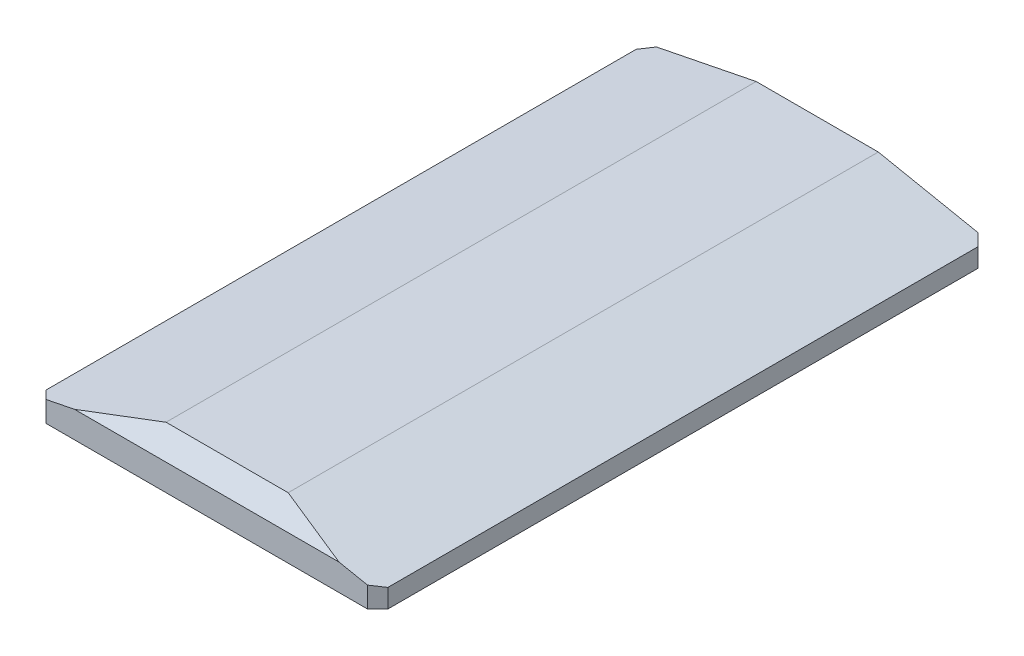
ISO-10303-21;
HEADER;
FILE_DESCRIPTION(('STEP AP214'),'2;1');
FILE_NAME('part.step','',(''),(''),'','','');
FILE_SCHEMA(('AUTOMOTIVE_DESIGN { 1 0 10303 214 1 1 1 1 }'));
ENDSEC;
DATA;
#1=APPLICATION_CONTEXT('core data for automotive mechanical design processes');
#2=APPLICATION_PROTOCOL_DEFINITION('international standard','automotive_design',2000,#1);
#3=PRODUCT_CONTEXT('',#1,'mechanical');
#4=PRODUCT('Part','Part','',(#3));
#5=PRODUCT_RELATED_PRODUCT_CATEGORY('part','',(#4));
#6=PRODUCT_DEFINITION_FORMATION('','',#4);
#7=PRODUCT_DEFINITION_CONTEXT('part definition',#1,'design');
#8=PRODUCT_DEFINITION('design','',#6,#7);
#9=PRODUCT_DEFINITION_SHAPE('','',#8);
#10=(LENGTH_UNIT() NAMED_UNIT(*) SI_UNIT(.MILLI.,.METRE.));
#11=(NAMED_UNIT(*) PLANE_ANGLE_UNIT() SI_UNIT($,.RADIAN.));
#12=(NAMED_UNIT(*) SI_UNIT($,.STERADIAN.) SOLID_ANGLE_UNIT());
#13=UNCERTAINTY_MEASURE_WITH_UNIT(LENGTH_MEASURE(1.E-05),#10,'distance_accuracy_value','');
#14=(GEOMETRIC_REPRESENTATION_CONTEXT(3) GLOBAL_UNCERTAINTY_ASSIGNED_CONTEXT((#13)) GLOBAL_UNIT_ASSIGNED_CONTEXT((#10,
#11,#12)) REPRESENTATION_CONTEXT('',''));
#15=CARTESIAN_POINT('',(0.,0.,0.));
#16=DIRECTION('',(0.,0.,1.));
#17=DIRECTION('',(1.,0.,0.));
#18=AXIS2_PLACEMENT_3D('',#15,#16,#17);
#19=CARTESIAN_POINT('',(-8.49999999999682,0.899999999999724,-3.50000000000011));
#20=DIRECTION('',(0.,0.,-1.));
#21=DIRECTION('',(-1.,0.,0.));
#22=AXIS2_PLACEMENT_3D('',#19,#20,#21);
#23=PLANE('',#22);
#24=DIRECTION('',(1.,0.,0.));
#25=VECTOR('',#24,1.);
#26=CARTESIAN_POINT('',(2.43926218353007,0.900000000000079,-3.50000000000011));
#27=LINE('',#26,#25);
#28=CARTESIAN_POINT('',(-7.89999999999684,0.899999999999739,-3.50000000000011));
#29=VERTEX_POINT('',#28);
#30=CARTESIAN_POINT('',(7.90000000000327,0.900000000000259,-3.50000000000011));
#31=VERTEX_POINT('',#30);
#32=EDGE_CURVE('E217',#29,#31,#27,.T.);
#33=ORIENTED_EDGE('',*,*,#32,.F.);
#34=DIRECTION('',(0.,1.,0.));
#35=VECTOR('',#34,1.);
#36=CARTESIAN_POINT('',(-7.89999999999684,0.899999999999724,-3.50000000000011));
#37=LINE('',#36,#35);
#38=CARTESIAN_POINT('',(-7.89999999999684,1.9200000000006,-3.50000000000011));
#39=VERTEX_POINT('',#38);
#40=EDGE_CURVE('E282',#29,#39,#37,.T.);
#41=ORIENTED_EDGE('',*,*,#40,.T.);
#42=DIRECTION('',(-0.980580675690923,-0.196116135138171,0.));
#43=VECTOR('',#42,1.);
#44=CARTESIAN_POINT('',(-3.,2.8999999999999,-3.50000000000011));
#45=LINE('',#44,#43);
#46=CARTESIAN_POINT('',(-3.,2.8999999999999,-3.50000000000011));
#47=VERTEX_POINT('',#46);
#48=EDGE_CURVE('E222',#47,#39,#45,.T.);
#49=ORIENTED_EDGE('',*,*,#48,.F.);
#50=DIRECTION('',(-1.,0.,0.));
#51=VECTOR('',#50,1.);
#52=CARTESIAN_POINT('',(2.99999999999999,2.9000000000001,-3.50000000000011));
#53=LINE('',#52,#51);
#54=CARTESIAN_POINT('',(2.99999999999999,2.9000000000001,-3.50000000000011));
#55=VERTEX_POINT('',#54);
#56=EDGE_CURVE('E205',#55,#47,#53,.T.);
#57=ORIENTED_EDGE('',*,*,#56,.F.);
#58=DIRECTION('',(-0.980580675690916,0.196116135138204,0.));
#59=VECTOR('',#58,1.);
#60=CARTESIAN_POINT('',(8.40000000000329,1.81999999999932,-3.50000000000011));
#61=LINE('',#60,#59);
#62=CARTESIAN_POINT('',(7.90000000000327,1.91999999999934,-3.50000000000011));
#63=VERTEX_POINT('',#62);
#64=EDGE_CURVE('E213',#63,#55,#61,.T.);
#65=ORIENTED_EDGE('',*,*,#64,.F.);
#66=DIRECTION('',(0.,-1.,0.));
#67=VECTOR('',#66,1.);
#68=CARTESIAN_POINT('',(7.90000000000327,0.899999999999724,-3.50000000000012));
#69=LINE('',#68,#67);
#70=EDGE_CURVE('E280',#63,#31,#69,.T.);
#71=ORIENTED_EDGE('',*,*,#70,.T.);
#72=EDGE_LOOP('',(#33,#41,#49,#57,#65,#71));
#73=FACE_BOUND('',#72,.T.);
#74=ADVANCED_FACE('F39',(#73),#23,.T.);
#75=CARTESIAN_POINT('',(2.99999999999999,2.9000000000001,-20.4186287860456));
#76=DIRECTION('',(0.,1.,0.));
#77=DIRECTION('',(-1.,0.,0.));
#78=AXIS2_PLACEMENT_3D('',#75,#76,#77);
#79=PLANE('',#78);
#80=DIRECTION('',(1.,0.,0.));
#81=VECTOR('',#80,1.);
#82=CARTESIAN_POINT('',(-8.39999999999685,2.9000000000001,25.4999999999997));
#83=LINE('',#82,#81);
#84=CARTESIAN_POINT('',(-2.99999999999903,2.9000000000001,25.4999999999997));
#85=VERTEX_POINT('',#84);
#86=CARTESIAN_POINT('',(2.99999999999999,2.9000000000001,25.4999999999997));
#87=VERTEX_POINT('',#86);
#88=EDGE_CURVE('E192',#85,#87,#83,.T.);
#89=ORIENTED_EDGE('',*,*,#88,.T.);
#90=DIRECTION('',(0.,0.,1.));
#91=VECTOR('',#90,1.);
#92=CARTESIAN_POINT('',(2.99999999999999,2.9000000000001,-20.4186287860456));
#93=LINE('',#92,#91);
#94=EDGE_CURVE('E215',#55,#87,#93,.T.);
#95=ORIENTED_EDGE('',*,*,#94,.F.);
#96=ORIENTED_EDGE('',*,*,#56,.T.);
#97=DIRECTION('',(0.,0.,1.));
#98=VECTOR('',#97,1.);
#99=CARTESIAN_POINT('',(-3.,2.8999999999999,-20.4186287860456));
#100=LINE('',#99,#98);
#101=EDGE_CURVE('E212',#47,#85,#100,.T.);
#102=ORIENTED_EDGE('',*,*,#101,.T.);
#103=EDGE_LOOP('',(#89,#95,#96,#102));
#104=FACE_BOUND('',#103,.T.);
#105=ADVANCED_FACE('F315',(#104),#79,.T.);
#106=CARTESIAN_POINT('',(-3.,2.8999999999999,-20.4186287860456));
#107=DIRECTION('',(-0.196116135138171,0.980580675690923,0.));
#108=DIRECTION('',(-0.980580675690923,-0.196116135138171,0.));
#109=AXIS2_PLACEMENT_3D('',#106,#107,#108);
#110=PLANE('',#109);
#111=ORIENTED_EDGE('',*,*,#48,.T.);
#112=DIRECTION('',(0.700140042014009,0.140028008402792,-0.700140042014003));
#113=VECTOR('',#112,1.);
#114=CARTESIAN_POINT('',(2.89148469904348,4.07829693980852,-14.2914846990403));
#115=LINE('',#114,#113);
#116=CARTESIAN_POINT('',(-8.39999999999685,1.82000000000061,-3.00000000000011));
#117=VERTEX_POINT('',#116);
#118=EDGE_CURVE('E286',#39,#117,#115,.F.);
#119=ORIENTED_EDGE('',*,*,#118,.T.);
#120=DIRECTION('',(0.,0.,1.));
#121=VECTOR('',#120,1.);
#122=CARTESIAN_POINT('',(-8.39999999999685,1.82000000000061,-20.4186287860456));
#123=LINE('',#122,#121);
#124=CARTESIAN_POINT('',(-8.39999999999685,1.82000000000061,25.9999999999999));
#125=VERTEX_POINT('',#124);
#126=EDGE_CURVE('E225',#117,#125,#123,.T.);
#127=ORIENTED_EDGE('',*,*,#126,.T.);
#128=DIRECTION('',(-0.700140042014003,-0.140028008402791,-0.700140042014008));
#129=VECTOR('',#128,1.);
#130=CARTESIAN_POINT('',(-28.4012886206091,-2.18025772412156,5.99871137938753));
#131=LINE('',#130,#129);
#132=CARTESIAN_POINT('',(-7.89999999999685,1.9200000000006,26.4999999999999));
#133=VERTEX_POINT('',#132);
#134=EDGE_CURVE('E284',#125,#133,#131,.F.);
#135=ORIENTED_EDGE('',*,*,#134,.T.);
#136=DIRECTION('',(-0.980580675690923,-0.196116135138171,0.));
#137=VECTOR('',#136,1.);
#138=CARTESIAN_POINT('',(-3.,2.8999999999999,26.4999999999999));
#139=LINE('',#138,#137);
#140=CARTESIAN_POINT('',(-6.49999999999961,2.20000000000003,26.4999999999999));
#141=VERTEX_POINT('',#140);
#142=EDGE_CURVE('E206',#141,#133,#139,.T.);
#143=ORIENTED_EDGE('',*,*,#142,.F.);
#144=DIRECTION('',(-0.944223223798798,-0.188844644759746,0.269778063942513));
#145=VECTOR('',#144,1.);
#146=CARTESIAN_POINT('',(8.6968850619476,5.23937701238926,22.1580328394435));
#147=LINE('',#146,#145);
#148=EDGE_CURVE('E199',#85,#141,#147,.T.);
#149=ORIENTED_EDGE('',*,*,#148,.F.);
#150=ORIENTED_EDGE('',*,*,#101,.F.);
#151=EDGE_LOOP('',(#111,#119,#127,#135,#143,#149,#150));
#152=FACE_BOUND('',#151,.T.);
#153=ADVANCED_FACE('F319',(#152),#110,.T.);
#154=CARTESIAN_POINT('',(-8.39999999999685,1.80000000000061,-20.4186287860456));
#155=DIRECTION('',(-1.,0.,0.));
#156=DIRECTION('',(0.,0.,1.));
#157=AXIS2_PLACEMENT_3D('',#154,#155,#156);
#158=PLANE('',#157);
#159=ORIENTED_EDGE('',*,*,#126,.F.);
#160=DIRECTION('',(0.,-1.,0.));
#161=VECTOR('',#160,1.);
#162=CARTESIAN_POINT('',(-8.39999999999685,1.80000000000061,-3.00000000000011));
#163=LINE('',#162,#161);
#164=CARTESIAN_POINT('',(-8.39999999999685,0.899999999999724,-3.00000000000011));
#165=VERTEX_POINT('',#164);
#166=EDGE_CURVE('E269',#117,#165,#163,.T.);
#167=ORIENTED_EDGE('',*,*,#166,.T.);
#168=DIRECTION('',(0.,0.,1.));
#169=VECTOR('',#168,1.);
#170=CARTESIAN_POINT('',(-8.39999999999685,0.899999999999724,-20.4186287860456));
#171=LINE('',#170,#169);
#172=CARTESIAN_POINT('',(-8.39999999999685,0.899999999999724,25.9999999999999));
#173=VERTEX_POINT('',#172);
#174=EDGE_CURVE('E221',#165,#173,#171,.T.);
#175=ORIENTED_EDGE('',*,*,#174,.T.);
#176=DIRECTION('',(0.,1.,0.));
#177=VECTOR('',#176,1.);
#178=CARTESIAN_POINT('',(-8.39999999999685,1.80000000000061,25.9999999999999));
#179=LINE('',#178,#177);
#180=EDGE_CURVE('E257',#173,#125,#179,.T.);
#181=ORIENTED_EDGE('',*,*,#180,.T.);
#182=EDGE_LOOP('',(#159,#167,#175,#181));
#183=FACE_BOUND('',#182,.T.);
#184=ADVANCED_FACE('F324',(#183),#158,.T.);
#185=CARTESIAN_POINT('',(2.43926218353006,0.900000000000079,-20.4186287860456));
#186=DIRECTION('',(0.,-1.,0.));
#187=DIRECTION('',(1.,0.,0.));
#188=AXIS2_PLACEMENT_3D('',#185,#186,#187);
#189=PLANE('',#188);
#190=DIRECTION('',(0.,0.,-1.));
#191=VECTOR('',#190,1.);
#192=CARTESIAN_POINT('',(-7.39999999999685,0.899999999999755,0.));
#193=LINE('',#192,#191);
#194=CARTESIAN_POINT('',(-7.39999999999685,0.899999999999755,25.4999999999999));
#195=VERTEX_POINT('',#194);
#196=CARTESIAN_POINT('',(-7.39999999999689,0.899999999999755,-2.50000000000011));
#197=VERTEX_POINT('',#196);
#198=EDGE_CURVE('E180',#195,#197,#193,.T.);
#199=ORIENTED_EDGE('',*,*,#198,.F.);
#200=DIRECTION('',(-1.,0.,0.));
#201=VECTOR('',#200,1.);
#202=CARTESIAN_POINT('',(0.,0.899999999999999,25.4999999999999));
#203=LINE('',#202,#201);
#204=CARTESIAN_POINT('',(7.40000000000328,0.900000000000242,25.4999999999999));
#205=VERTEX_POINT('',#204);
#206=EDGE_CURVE('E185',#205,#195,#203,.T.);
#207=ORIENTED_EDGE('',*,*,#206,.F.);
#208=DIRECTION('',(0.,0.,1.));
#209=VECTOR('',#208,1.);
#210=CARTESIAN_POINT('',(7.40000000000328,0.900000000000242,0.));
#211=LINE('',#210,#209);
#212=CARTESIAN_POINT('',(7.40000000000328,0.900000000000242,-2.50000000000011));
#213=VERTEX_POINT('',#212);
#214=EDGE_CURVE('E164',#213,#205,#211,.T.);
#215=ORIENTED_EDGE('',*,*,#214,.F.);
#216=DIRECTION('',(1.,0.,0.));
#217=VECTOR('',#216,1.);
#218=CARTESIAN_POINT('',(0.,0.899999999999999,-2.50000000000011));
#219=LINE('',#218,#217);
#220=EDGE_CURVE('E174',#197,#213,#219,.T.);
#221=ORIENTED_EDGE('',*,*,#220,.F.);
#222=EDGE_LOOP('',(#199,#207,#215,#221));
#223=FACE_BOUND('',#222,.T.);
#224=ORIENTED_EDGE('',*,*,#174,.F.);
#225=DIRECTION('',(-0.707106781186551,0.,0.707106781186544));
#226=VECTOR('',#225,1.);
#227=CARTESIAN_POINT('',(5.72894548478939,0.900000000000187,-17.1289454847862));
#228=LINE('',#227,#226);
#229=EDGE_CURVE('E278',#165,#29,#228,.F.);
#230=ORIENTED_EDGE('',*,*,#229,.T.);
#231=ORIENTED_EDGE('',*,*,#32,.T.);
#232=DIRECTION('',(-0.707106781186546,0.,-0.707106781186549));
#233=VECTOR('',#232,1.);
#234=CARTESIAN_POINT('',(-3.28968330125605,0.89999999999989,-14.6896833012595));
#235=LINE('',#234,#233);
#236=CARTESIAN_POINT('',(8.40000000000328,0.900000000000275,-3.0000000000001));
#237=VERTEX_POINT('',#236);
#238=EDGE_CURVE('E276',#31,#237,#235,.F.);
#239=ORIENTED_EDGE('',*,*,#238,.T.);
#240=DIRECTION('',(0.,0.,1.));
#241=VECTOR('',#240,1.);
#242=CARTESIAN_POINT('',(8.40000000000328,0.900000000000275,-20.4186287860456));
#243=LINE('',#242,#241);
#244=CARTESIAN_POINT('',(8.40000000000328,0.900000000000275,25.9999999999999));
#245=VERTEX_POINT('',#244);
#246=EDGE_CURVE('E220',#237,#245,#243,.T.);
#247=ORIENTED_EDGE('',*,*,#246,.T.);
#248=DIRECTION('',(0.707106781186544,0.,-0.707106781186551));
#249=VECTOR('',#248,1.);
#250=CARTESIAN_POINT('',(28.6289454847894,0.900000000000941,5.77105451521353));
#251=LINE('',#250,#249);
#252=CARTESIAN_POINT('',(7.90000000000329,0.900000000000259,26.4999999999999));
#253=VERTEX_POINT('',#252);
#254=EDGE_CURVE('E274',#245,#253,#251,.F.);
#255=ORIENTED_EDGE('',*,*,#254,.T.);
#256=DIRECTION('',(1.,0.,0.));
#257=VECTOR('',#256,1.);
#258=CARTESIAN_POINT('',(2.43926218353006,0.900000000000079,26.4999999999999));
#259=LINE('',#258,#257);
#260=CARTESIAN_POINT('',(-7.89999999999685,0.899999999999739,26.4999999999999));
#261=VERTEX_POINT('',#260);
#262=EDGE_CURVE('E202',#261,#253,#259,.T.);
#263=ORIENTED_EDGE('',*,*,#262,.F.);
#264=DIRECTION('',(0.707106781186545,0.,0.70710678118655));
#265=VECTOR('',#264,1.);
#266=CARTESIAN_POINT('',(-26.1896833012562,0.899999999999137,8.21031669874045));
#267=LINE('',#266,#265);
#268=EDGE_CURVE('E272',#261,#173,#267,.F.);
#269=ORIENTED_EDGE('',*,*,#268,.T.);
#270=EDGE_LOOP('',(#224,#230,#231,#239,#247,#255,#263,#269));
#271=FACE_BOUND('',#270,.T.);
#272=ADVANCED_FACE('F182',(#223,#271),#189,.T.);
#273=CARTESIAN_POINT('',(8.40000000000328,1.79999999999933,-20.4186287860456));
#274=DIRECTION('',(1.,0.,0.));
#275=DIRECTION('',(0.,0.,-1.));
#276=AXIS2_PLACEMENT_3D('',#273,#274,#275);
#277=PLANE('',#276);
#278=ORIENTED_EDGE('',*,*,#246,.F.);
#279=DIRECTION('',(0.,1.,0.));
#280=VECTOR('',#279,1.);
#281=CARTESIAN_POINT('',(8.40000000000328,1.79999999999933,-3.0000000000001));
#282=LINE('',#281,#280);
#283=CARTESIAN_POINT('',(8.40000000000328,1.81999999999932,-3.0000000000001));
#284=VERTEX_POINT('',#283);
#285=EDGE_CURVE('E290',#237,#284,#282,.T.);
#286=ORIENTED_EDGE('',*,*,#285,.T.);
#287=DIRECTION('',(0.,0.,1.));
#288=VECTOR('',#287,1.);
#289=CARTESIAN_POINT('',(8.40000000000328,1.81999999999932,-20.4186287860456));
#290=LINE('',#289,#288);
#291=CARTESIAN_POINT('',(8.40000000000328,1.81999999999932,25.9999999999999));
#292=VERTEX_POINT('',#291);
#293=EDGE_CURVE('E216',#284,#292,#290,.T.);
#294=ORIENTED_EDGE('',*,*,#293,.T.);
#295=DIRECTION('',(0.,-1.,0.));
#296=VECTOR('',#295,1.);
#297=CARTESIAN_POINT('',(8.40000000000328,1.79999999999933,25.9999999999999));
#298=LINE('',#297,#296);
#299=EDGE_CURVE('E288',#292,#245,#298,.T.);
#300=ORIENTED_EDGE('',*,*,#299,.T.);
#301=EDGE_LOOP('',(#278,#286,#294,#300));
#302=FACE_BOUND('',#301,.T.);
#303=ADVANCED_FACE('F418',(#302),#277,.T.);
#304=CARTESIAN_POINT('',(8.40000000000328,1.81999999999932,-20.4186287860456));
#305=DIRECTION('',(0.196116135138204,0.980580675690916,0.));
#306=DIRECTION('',(-0.980580675690916,0.196116135138204,0.));
#307=AXIS2_PLACEMENT_3D('',#304,#305,#306);
#308=PLANE('',#307);
#309=ORIENTED_EDGE('',*,*,#293,.F.);
#310=DIRECTION('',(0.700140042014002,-0.140028008402815,0.700140042014005));
#311=VECTOR('',#310,1.);
#312=CARTESIAN_POINT('',(-0.138543522567992,3.52770870451376,-11.5385435225714));
#313=LINE('',#312,#311);
#314=EDGE_CURVE('E294',#284,#63,#313,.F.);
#315=ORIENTED_EDGE('',*,*,#314,.T.);
#316=ORIENTED_EDGE('',*,*,#64,.T.);
#317=ORIENTED_EDGE('',*,*,#94,.T.);
#318=DIRECTION('',(-0.94422322379878,0.188844644759776,-0.269778063942555));
#319=VECTOR('',#318,1.);
#320=CARTESIAN_POINT('',(-3.6898981623829,4.23797963247682,23.5886005250329));
#321=LINE('',#320,#319);
#322=CARTESIAN_POINT('',(6.49999999999992,2.20000000000003,26.4999999999999));
#323=VERTEX_POINT('',#322);
#324=EDGE_CURVE('E197',#323,#87,#321,.T.);
#325=ORIENTED_EDGE('',*,*,#324,.F.);
#326=DIRECTION('',(-0.980580675690916,0.196116135138204,0.));
#327=VECTOR('',#326,1.);
#328=CARTESIAN_POINT('',(8.40000000000328,1.81999999999932,26.4999999999999));
#329=LINE('',#328,#327);
#330=CARTESIAN_POINT('',(7.90000000000329,1.91999999999933,26.4999999999999));
#331=VERTEX_POINT('',#330);
#332=EDGE_CURVE('E201',#331,#323,#329,.T.);
#333=ORIENTED_EDGE('',*,*,#332,.F.);
#334=DIRECTION('',(-0.700140042014,0.140028008402815,0.700140042014007));
#335=VECTOR('',#334,1.);
#336=CARTESIAN_POINT('',(31.1542297970843,-2.73084595941736,3.24577020291864));
#337=LINE('',#336,#335);
#338=EDGE_CURVE('E55',#331,#292,#337,.F.);
#339=ORIENTED_EDGE('',*,*,#338,.T.);
#340=EDGE_LOOP('',(#309,#315,#316,#317,#325,#333,#339));
#341=FACE_BOUND('',#340,.T.);
#342=ADVANCED_FACE('F309',(#341),#308,.T.);
#343=CARTESIAN_POINT('',(-7.49999999999675,-1.2,26.4999999999999));
#344=DIRECTION('',(0.,0.,1.));
#345=DIRECTION('',(1.,0.,0.));
#346=AXIS2_PLACEMENT_3D('',#343,#344,#345);
#347=PLANE('',#346);
#348=ORIENTED_EDGE('',*,*,#262,.T.);
#349=DIRECTION('',(0.,1.,0.));
#350=VECTOR('',#349,1.);
#351=CARTESIAN_POINT('',(7.90000000000329,-1.2,26.4999999999999));
#352=LINE('',#351,#350);
#353=EDGE_CURVE('E11',#253,#331,#352,.T.);
#354=ORIENTED_EDGE('',*,*,#353,.T.);
#355=ORIENTED_EDGE('',*,*,#332,.T.);
#356=DIRECTION('',(1.,0.,0.));
#357=VECTOR('',#356,1.);
#358=CARTESIAN_POINT('',(-7.49999999999675,2.20000000000003,26.4999999999999));
#359=LINE('',#358,#357);
#360=EDGE_CURVE('E237',#141,#323,#359,.T.);
#361=ORIENTED_EDGE('',*,*,#360,.F.);
#362=ORIENTED_EDGE('',*,*,#142,.T.);
#363=DIRECTION('',(0.,-1.,0.));
#364=VECTOR('',#363,1.);
#365=CARTESIAN_POINT('',(-7.89999999999685,-1.2,26.4999999999999));
#366=LINE('',#365,#364);
#367=EDGE_CURVE('E48',#133,#261,#366,.T.);
#368=ORIENTED_EDGE('',*,*,#367,.T.);
#369=EDGE_LOOP('',(#348,#354,#355,#361,#362,#368));
#370=FACE_BOUND('',#369,.T.);
#371=ADVANCED_FACE('F299',(#370),#347,.T.);
#372=CARTESIAN_POINT('',(-8.39999999999685,2.20000000000003,26.4999999999999));
#373=DIRECTION('',(0.,-0.819231920519059,-0.573462344363302));
#374=DIRECTION('',(0.,0.573462344363302,-0.819231920519059));
#375=AXIS2_PLACEMENT_3D('',#372,#373,#374);
#376=PLANE('',#375);
#377=ORIENTED_EDGE('',*,*,#148,.T.);
#378=ORIENTED_EDGE('',*,*,#360,.T.);
#379=ORIENTED_EDGE('',*,*,#324,.T.);
#380=ORIENTED_EDGE('',*,*,#88,.F.);
#381=EDGE_LOOP('',(#377,#378,#379,#380));
#382=FACE_BOUND('',#381,.T.);
#383=ADVANCED_FACE('F312',(#382),#376,.F.);
#384=CARTESIAN_POINT('',(-7.39999999999689,1.89999999999976,0.));
#385=DIRECTION('',(-1.,0.,0.));
#386=DIRECTION('',(0.,-1.,0.));
#387=AXIS2_PLACEMENT_3D('',#384,#385,#386);
#388=PLANE('',#387);
#389=DIRECTION('',(0.,-1.,0.));
#390=VECTOR('',#389,1.);
#391=CARTESIAN_POINT('',(-7.39999999999689,1.89999999999976,-2.50000000000011));
#392=LINE('',#391,#390);
#393=CARTESIAN_POINT('',(-7.39999999999687,1.39999999999975,-2.50000000000011));
#394=VERTEX_POINT('',#393);
#395=EDGE_CURVE('E171',#394,#197,#392,.T.);
#396=ORIENTED_EDGE('',*,*,#395,.F.);
#397=DIRECTION('',(0.,0.,1.));
#398=VECTOR('',#397,1.);
#399=CARTESIAN_POINT('',(-7.39999999999687,1.39999999999975,0.));
#400=LINE('',#399,#398);
#401=CARTESIAN_POINT('',(-7.39999999999687,1.39999999999975,25.4999999999999));
#402=VERTEX_POINT('',#401);
#403=EDGE_CURVE('E255',#394,#402,#400,.T.);
#404=ORIENTED_EDGE('',*,*,#403,.T.);
#405=DIRECTION('',(0.,-1.,0.));
#406=VECTOR('',#405,1.);
#407=CARTESIAN_POINT('',(-7.39999999999689,1.89999999999976,25.4999999999999));
#408=LINE('',#407,#406);
#409=EDGE_CURVE('E190',#402,#195,#408,.T.);
#410=ORIENTED_EDGE('',*,*,#409,.T.);
#411=ORIENTED_EDGE('',*,*,#198,.T.);
#412=EDGE_LOOP('',(#396,#404,#410,#411));
#413=FACE_BOUND('',#412,.T.);
#414=ADVANCED_FACE('F394',(#413),#388,.F.);
#415=CARTESIAN_POINT('',(0.,1.9,25.4999999999999));
#416=DIRECTION('',(0.,0.,1.));
#417=DIRECTION('',(1.,0.,0.));
#418=AXIS2_PLACEMENT_3D('',#415,#416,#417);
#419=PLANE('',#418);
#420=ORIENTED_EDGE('',*,*,#409,.F.);
#421=DIRECTION('',(1.,0.,0.));
#422=VECTOR('',#421,1.);
#423=CARTESIAN_POINT('',(0.,1.39999999999999,25.4999999999999));
#424=LINE('',#423,#422);
#425=CARTESIAN_POINT('',(7.40000000000327,1.40000000000024,25.4999999999999));
#426=VERTEX_POINT('',#425);
#427=EDGE_CURVE('E249',#402,#426,#424,.T.);
#428=ORIENTED_EDGE('',*,*,#427,.T.);
#429=DIRECTION('',(0.,-1.,0.));
#430=VECTOR('',#429,1.);
#431=CARTESIAN_POINT('',(7.40000000000325,1.90000000000024,25.4999999999999));
#432=LINE('',#431,#430);
#433=EDGE_CURVE('E170',#426,#205,#432,.T.);
#434=ORIENTED_EDGE('',*,*,#433,.T.);
#435=ORIENTED_EDGE('',*,*,#206,.T.);
#436=EDGE_LOOP('',(#420,#428,#434,#435));
#437=FACE_BOUND('',#436,.T.);
#438=ADVANCED_FACE('F397',(#437),#419,.F.);
#439=CARTESIAN_POINT('',(7.40000000000325,1.90000000000024,0.));
#440=DIRECTION('',(1.,0.,0.));
#441=DIRECTION('',(0.,1.,0.));
#442=AXIS2_PLACEMENT_3D('',#439,#440,#441);
#443=PLANE('',#442);
#444=ORIENTED_EDGE('',*,*,#433,.F.);
#445=DIRECTION('',(0.,0.,-1.));
#446=VECTOR('',#445,1.);
#447=CARTESIAN_POINT('',(7.40000000000327,1.40000000000024,0.));
#448=LINE('',#447,#446);
#449=CARTESIAN_POINT('',(7.40000000000327,1.40000000000024,-2.50000000000011));
#450=VERTEX_POINT('',#449);
#451=EDGE_CURVE('E167',#426,#450,#448,.T.);
#452=ORIENTED_EDGE('',*,*,#451,.T.);
#453=DIRECTION('',(0.,-1.,0.));
#454=VECTOR('',#453,1.);
#455=CARTESIAN_POINT('',(7.40000000000325,1.90000000000024,-2.50000000000011));
#456=LINE('',#455,#454);
#457=EDGE_CURVE('E159',#450,#213,#456,.T.);
#458=ORIENTED_EDGE('',*,*,#457,.T.);
#459=ORIENTED_EDGE('',*,*,#214,.T.);
#460=EDGE_LOOP('',(#444,#452,#458,#459));
#461=FACE_BOUND('',#460,.T.);
#462=ADVANCED_FACE('F162',(#461),#443,.F.);
#463=CARTESIAN_POINT('',(0.,1.9,-2.50000000000011));
#464=DIRECTION('',(0.,0.,-1.));
#465=DIRECTION('',(-1.,0.,0.));
#466=AXIS2_PLACEMENT_3D('',#463,#464,#465);
#467=PLANE('',#466);
#468=ORIENTED_EDGE('',*,*,#457,.F.);
#469=DIRECTION('',(-1.,0.,0.));
#470=VECTOR('',#469,1.);
#471=CARTESIAN_POINT('',(0.,1.39999999999999,-2.50000000000011));
#472=LINE('',#471,#470);
#473=EDGE_CURVE('E253',#450,#394,#472,.T.);
#474=ORIENTED_EDGE('',*,*,#473,.T.);
#475=ORIENTED_EDGE('',*,*,#395,.T.);
#476=ORIENTED_EDGE('',*,*,#220,.T.);
#477=EDGE_LOOP('',(#468,#474,#475,#476));
#478=FACE_BOUND('',#477,.T.);
#479=ADVANCED_FACE('F175',(#478),#467,.F.);
#480=CARTESIAN_POINT('',(0.,1.9,0.));
#481=DIRECTION('',(0.,-1.,0.));
#482=DIRECTION('',(1.,0.,0.));
#483=AXIS2_PLACEMENT_3D('',#480,#481,#482);
#484=PLANE('',#483);
#485=DIRECTION('',(0.,0.,1.));
#486=VECTOR('',#485,1.);
#487=CARTESIAN_POINT('',(6.90000000000324,1.90000000000023,0.));
#488=LINE('',#487,#486);
#489=CARTESIAN_POINT('',(6.90000000000324,1.90000000000023,-2.0000000000001));
#490=VERTEX_POINT('',#489);
#491=CARTESIAN_POINT('',(6.90000000000324,1.90000000000023,24.9999999999999));
#492=VERTEX_POINT('',#491);
#493=EDGE_CURVE('E244',#490,#492,#488,.T.);
#494=ORIENTED_EDGE('',*,*,#493,.T.);
#495=DIRECTION('',(-1.,0.,0.));
#496=VECTOR('',#495,1.);
#497=CARTESIAN_POINT('',(0.,1.9,24.9999999999999));
#498=LINE('',#497,#496);
#499=CARTESIAN_POINT('',(-6.89999999999688,1.89999999999977,24.9999999999999));
#500=VERTEX_POINT('',#499);
#501=EDGE_CURVE('E246',#492,#500,#498,.T.);
#502=ORIENTED_EDGE('',*,*,#501,.T.);
#503=DIRECTION('',(0.,0.,-1.));
#504=VECTOR('',#503,1.);
#505=CARTESIAN_POINT('',(-6.89999999999688,1.89999999999977,0.));
#506=LINE('',#505,#504);
#507=CARTESIAN_POINT('',(-6.89999999999688,1.89999999999977,-2.0000000000001));
#508=VERTEX_POINT('',#507);
#509=EDGE_CURVE('E240',#500,#508,#506,.T.);
#510=ORIENTED_EDGE('',*,*,#509,.T.);
#511=DIRECTION('',(1.,0.,0.));
#512=VECTOR('',#511,1.);
#513=CARTESIAN_POINT('',(0.,1.9,-2.0000000000001));
#514=LINE('',#513,#512);
#515=EDGE_CURVE('E242',#508,#490,#514,.T.);
#516=ORIENTED_EDGE('',*,*,#515,.T.);
#517=EDGE_LOOP('',(#494,#502,#510,#516));
#518=FACE_BOUND('',#517,.T.);
#519=ADVANCED_FACE('F379',(#518),#484,.T.);
#520=CARTESIAN_POINT('',(0.,1.9,-2.0000000000001));
#521=DIRECTION('',(0.,0.707106781186551,-0.707106781186544));
#522=DIRECTION('',(1.,0.,0.));
#523=AXIS2_PLACEMENT_3D('',#520,#521,#522);
#524=PLANE('',#523);
#525=DIRECTION('',(0.577350269189609,0.577350269189641,0.577350269189628));
#526=VECTOR('',#525,1.);
#527=CARTESIAN_POINT('',(-4.599999999998,4.19999999999878,0.299999999998849));
#528=LINE('',#527,#526);
#529=EDGE_CURVE('E262',#394,#508,#528,.T.);
#530=ORIENTED_EDGE('',*,*,#529,.F.);
#531=ORIENTED_EDGE('',*,*,#473,.F.);
#532=DIRECTION('',(-0.577350269189647,0.577350269189603,0.577350269189628));
#533=VECTOR('',#532,1.);
#534=CARTESIAN_POINT('',(6.23333333333651,2.5666666666669,-1.3333333333334));
#535=LINE('',#534,#533);
#536=EDGE_CURVE('E265',#490,#450,#535,.F.);
#537=ORIENTED_EDGE('',*,*,#536,.F.);
#538=ORIENTED_EDGE('',*,*,#515,.F.);
#539=EDGE_LOOP('',(#530,#531,#537,#538));
#540=FACE_BOUND('',#539,.T.);
#541=ADVANCED_FACE('F374',(#540),#524,.F.);
#542=CARTESIAN_POINT('',(6.90000000000324,1.90000000000023,0.));
#543=DIRECTION('',(0.707106781186521,0.707106781186575,0.));
#544=DIRECTION('',(0.,0.,1.));
#545=AXIS2_PLACEMENT_3D('',#542,#543,#544);
#546=PLANE('',#545);
#547=ORIENTED_EDGE('',*,*,#536,.T.);
#548=ORIENTED_EDGE('',*,*,#451,.F.);
#549=DIRECTION('',(-0.577350269189646,0.577350269189602,-0.577350269189629));
#550=VECTOR('',#549,1.);
#551=CARTESIAN_POINT('',(4.60000000000205,4.20000000000124,22.6999999999988));
#552=LINE('',#551,#550);
#553=EDGE_CURVE('E260',#492,#426,#552,.F.);
#554=ORIENTED_EDGE('',*,*,#553,.F.);
#555=ORIENTED_EDGE('',*,*,#493,.F.);
#556=EDGE_LOOP('',(#547,#548,#554,#555));
#557=FACE_BOUND('',#556,.T.);
#558=ADVANCED_FACE('F368',(#557),#546,.F.);
#559=CARTESIAN_POINT('',(-6.89999999999688,1.89999999999977,0.));
#560=DIRECTION('',(-0.707106781186567,0.707106781186528,0.));
#561=DIRECTION('',(0.,0.,-1.));
#562=AXIS2_PLACEMENT_3D('',#559,#560,#561);
#563=PLANE('',#562);
#564=ORIENTED_EDGE('',*,*,#529,.T.);
#565=ORIENTED_EDGE('',*,*,#509,.F.);
#566=DIRECTION('',(-0.577350269189608,-0.57735026918964,0.577350269189629));
#567=VECTOR('',#566,1.);
#568=CARTESIAN_POINT('',(-4.599999999998,4.19999999999877,22.7000000000009));
#569=LINE('',#568,#567);
#570=EDGE_CURVE('E258',#402,#500,#569,.F.);
#571=ORIENTED_EDGE('',*,*,#570,.F.);
#572=ORIENTED_EDGE('',*,*,#403,.F.);
#573=EDGE_LOOP('',(#564,#565,#571,#572));
#574=FACE_BOUND('',#573,.T.);
#575=ADVANCED_FACE('F344',(#574),#563,.F.);
#576=CARTESIAN_POINT('',(0.,1.9,24.9999999999999));
#577=DIRECTION('',(0.,0.707106781186552,0.707106781186543));
#578=DIRECTION('',(-1.,0.,0.));
#579=AXIS2_PLACEMENT_3D('',#576,#577,#578);
#580=PLANE('',#579);
#581=ORIENTED_EDGE('',*,*,#553,.T.);
#582=ORIENTED_EDGE('',*,*,#427,.F.);
#583=ORIENTED_EDGE('',*,*,#570,.T.);
#584=ORIENTED_EDGE('',*,*,#501,.F.);
#585=EDGE_LOOP('',(#581,#582,#583,#584));
#586=FACE_BOUND('',#585,.T.);
#587=ADVANCED_FACE('F336',(#586),#580,.F.);
#588=CARTESIAN_POINT('',(-8.39999999999685,1.80000000000061,-3.00000000000011));
#589=DIRECTION('',(0.707106781186544,0.,0.707106781186551));
#590=DIRECTION('',(0.,-1.,0.));
#591=AXIS2_PLACEMENT_3D('',#588,#589,#590);
#592=PLANE('',#591);
#593=ORIENTED_EDGE('',*,*,#118,.F.);
#594=ORIENTED_EDGE('',*,*,#40,.F.);
#595=ORIENTED_EDGE('',*,*,#229,.F.);
#596=ORIENTED_EDGE('',*,*,#166,.F.);
#597=EDGE_LOOP('',(#593,#594,#595,#596));
#598=FACE_BOUND('',#597,.T.);
#599=ADVANCED_FACE('F333',(#598),#592,.F.);
#600=CARTESIAN_POINT('',(8.40000000000328,1.79999999999933,-3.0000000000001));
#601=DIRECTION('',(-0.707106781186549,0.,0.707106781186546));
#602=DIRECTION('',(0.,1.,0.));
#603=AXIS2_PLACEMENT_3D('',#600,#601,#602);
#604=PLANE('',#603);
#605=ORIENTED_EDGE('',*,*,#238,.F.);
#606=ORIENTED_EDGE('',*,*,#70,.F.);
#607=ORIENTED_EDGE('',*,*,#314,.F.);
#608=ORIENTED_EDGE('',*,*,#285,.F.);
#609=EDGE_LOOP('',(#605,#606,#607,#608));
#610=FACE_BOUND('',#609,.T.);
#611=ADVANCED_FACE('F335',(#610),#604,.F.);
#612=CARTESIAN_POINT('',(7.90000000000329,-1.2,26.4999999999999));
#613=DIRECTION('',(-0.707106781186551,0.,-0.707106781186544));
#614=DIRECTION('',(0.,1.,0.));
#615=AXIS2_PLACEMENT_3D('',#612,#613,#614);
#616=PLANE('',#615);
#617=ORIENTED_EDGE('',*,*,#254,.F.);
#618=ORIENTED_EDGE('',*,*,#299,.F.);
#619=ORIENTED_EDGE('',*,*,#338,.F.);
#620=ORIENTED_EDGE('',*,*,#353,.F.);
#621=EDGE_LOOP('',(#617,#618,#619,#620));
#622=FACE_BOUND('',#621,.T.);
#623=ADVANCED_FACE('F307',(#622),#616,.F.);
#624=CARTESIAN_POINT('',(-7.89999999999685,-1.2,26.4999999999999));
#625=DIRECTION('',(0.70710678118655,0.,-0.707106781186545));
#626=DIRECTION('',(0.,-1.,0.));
#627=AXIS2_PLACEMENT_3D('',#624,#625,#626);
#628=PLANE('',#627);
#629=ORIENTED_EDGE('',*,*,#134,.F.);
#630=ORIENTED_EDGE('',*,*,#180,.F.);
#631=ORIENTED_EDGE('',*,*,#268,.F.);
#632=ORIENTED_EDGE('',*,*,#367,.F.);
#633=EDGE_LOOP('',(#629,#630,#631,#632));
#634=FACE_BOUND('',#633,.T.);
#635=ADVANCED_FACE('F42',(#634),#628,.F.);
#636=CLOSED_SHELL('',(#74,#105,#153,#184,#272,#303,#342,#371,#383,#414,#438,#462,#479,#519,#541,
#558,#575,#587,#599,#611,#623,#635));
#637=MANIFOLD_SOLID_BREP('B2',#636);
#638=ADVANCED_BREP_SHAPE_REPRESENTATION('',(#18,#637),#14);
#639=SHAPE_DEFINITION_REPRESENTATION(#9,#638);
ENDSEC;
END-ISO-10303-21;
